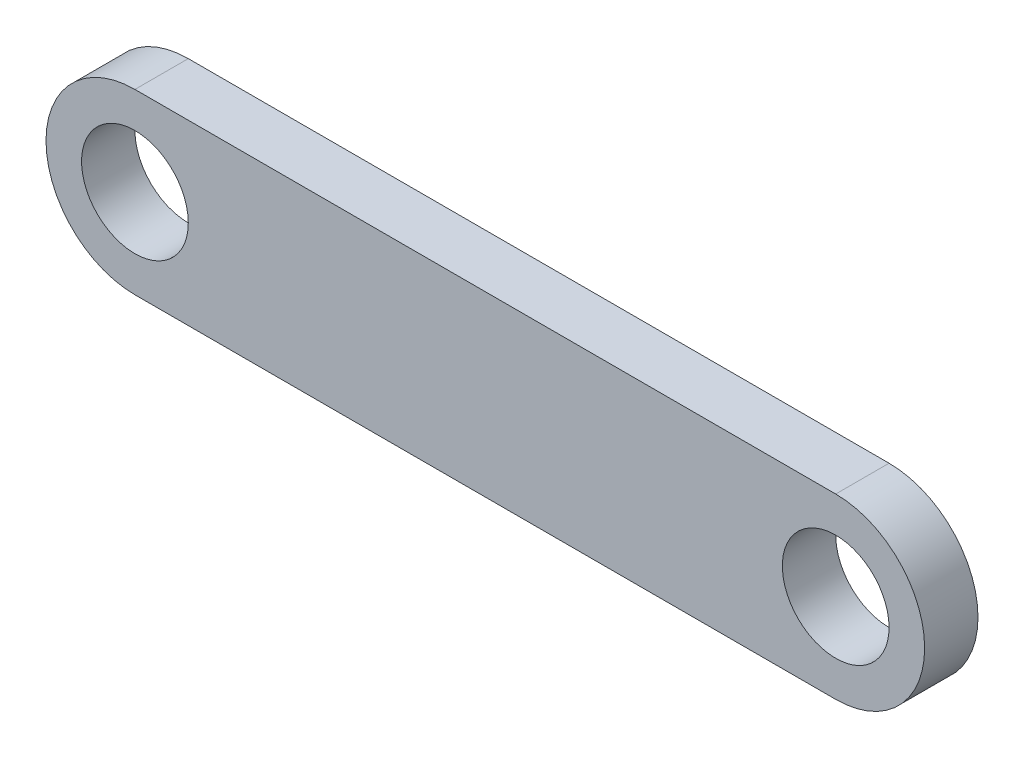
ISO-10303-21;
HEADER;
FILE_DESCRIPTION(('STEP AP214'),'2;1');
FILE_NAME('part.step','',(''),(''),'','','');
FILE_SCHEMA(('AUTOMOTIVE_DESIGN { 1 0 10303 214 1 1 1 1 }'));
ENDSEC;
DATA;
#1=APPLICATION_CONTEXT('core data for automotive mechanical design processes');
#2=APPLICATION_PROTOCOL_DEFINITION('international standard','automotive_design',2000,#1);
#3=PRODUCT_CONTEXT('',#1,'mechanical');
#4=PRODUCT('Part','Part','',(#3));
#5=PRODUCT_RELATED_PRODUCT_CATEGORY('part','',(#4));
#6=PRODUCT_DEFINITION_FORMATION('','',#4);
#7=PRODUCT_DEFINITION_CONTEXT('part definition',#1,'design');
#8=PRODUCT_DEFINITION('design','',#6,#7);
#9=PRODUCT_DEFINITION_SHAPE('','',#8);
#10=(LENGTH_UNIT() NAMED_UNIT(*) SI_UNIT(.MILLI.,.METRE.));
#11=(NAMED_UNIT(*) PLANE_ANGLE_UNIT() SI_UNIT($,.RADIAN.));
#12=(NAMED_UNIT(*) SI_UNIT($,.STERADIAN.) SOLID_ANGLE_UNIT());
#13=UNCERTAINTY_MEASURE_WITH_UNIT(LENGTH_MEASURE(1.E-05),#10,'distance_accuracy_value','');
#14=(GEOMETRIC_REPRESENTATION_CONTEXT(3) GLOBAL_UNCERTAINTY_ASSIGNED_CONTEXT((#13)) GLOBAL_UNIT_ASSIGNED_CONTEXT((#10,
#11,#12)) REPRESENTATION_CONTEXT('',''));
#15=CARTESIAN_POINT('',(0.,0.,0.));
#16=DIRECTION('',(0.,0.,1.));
#17=DIRECTION('',(1.,0.,0.));
#18=AXIS2_PLACEMENT_3D('',#15,#16,#17);
#19=CARTESIAN_POINT('',(-19.7,0.,3.));
#20=DIRECTION('',(0.,0.,1.));
#21=DIRECTION('',(1.,0.,0.));
#22=AXIS2_PLACEMENT_3D('',#19,#20,#21);
#23=PLANE('',#22);
#24=CARTESIAN_POINT('',(-19.7,0.,3.));
#25=DIRECTION('',(0.,0.,1.));
#26=DIRECTION('',(1.,0.,0.));
#27=AXIS2_PLACEMENT_3D('',#24,#25,#26);
#28=CIRCLE('',#27,3.);
#29=CARTESIAN_POINT('',(-16.7,0.,3.));
#30=VERTEX_POINT('',#29);
#31=EDGE_CURVE('E99',#30,#30,#28,.T.);
#32=ORIENTED_EDGE('',*,*,#31,.F.);
#33=EDGE_LOOP('',(#32));
#34=FACE_BOUND('',#33,.T.);
#35=CARTESIAN_POINT('',(-19.7,0.,3.));
#36=DIRECTION('',(0.,0.,1.));
#37=DIRECTION('',(1.,0.,0.));
#38=AXIS2_PLACEMENT_3D('',#35,#36,#37);
#39=CIRCLE('',#38,5.);
#40=CARTESIAN_POINT('',(-19.7,5.,3.));
#41=VERTEX_POINT('',#40);
#42=CARTESIAN_POINT('',(-19.7,-5.,3.));
#43=VERTEX_POINT('',#42);
#44=EDGE_CURVE('E84',#41,#43,#39,.T.);
#45=ORIENTED_EDGE('',*,*,#44,.T.);
#46=DIRECTION('',(1.,0.,0.));
#47=VECTOR('',#46,1.);
#48=CARTESIAN_POINT('',(-19.7,-5.,3.));
#49=LINE('',#48,#47);
#50=CARTESIAN_POINT('',(19.7,-4.99999999999999,3.));
#51=VERTEX_POINT('',#50);
#52=EDGE_CURVE('E79',#43,#51,#49,.T.);
#53=ORIENTED_EDGE('',*,*,#52,.T.);
#54=CARTESIAN_POINT('',(19.7,0.,3.));
#55=DIRECTION('',(0.,0.,1.));
#56=DIRECTION('',(1.,0.,0.));
#57=AXIS2_PLACEMENT_3D('',#54,#55,#56);
#58=CIRCLE('',#57,5.);
#59=CARTESIAN_POINT('',(19.7,5.00000000000001,3.));
#60=VERTEX_POINT('',#59);
#61=EDGE_CURVE('E82',#51,#60,#58,.T.);
#62=ORIENTED_EDGE('',*,*,#61,.T.);
#63=DIRECTION('',(-1.,0.,0.));
#64=VECTOR('',#63,1.);
#65=CARTESIAN_POINT('',(-19.7,5.,3.));
#66=LINE('',#65,#64);
#67=EDGE_CURVE('E49',#60,#41,#66,.T.);
#68=ORIENTED_EDGE('',*,*,#67,.T.);
#69=EDGE_LOOP('',(#45,#53,#62,#68));
#70=FACE_BOUND('',#69,.T.);
#71=CARTESIAN_POINT('',(19.7,0.,3.));
#72=DIRECTION('',(0.,0.,1.));
#73=DIRECTION('',(1.,0.,0.));
#74=AXIS2_PLACEMENT_3D('',#71,#72,#73);
#75=CIRCLE('',#74,3.);
#76=CARTESIAN_POINT('',(22.7,0.,3.));
#77=VERTEX_POINT('',#76);
#78=EDGE_CURVE('E114',#77,#77,#75,.T.);
#79=ORIENTED_EDGE('',*,*,#78,.F.);
#80=EDGE_LOOP('',(#79));
#81=FACE_BOUND('',#80,.T.);
#82=ADVANCED_FACE('F32',(#34,#70,#81),#23,.T.);
#83=CARTESIAN_POINT('',(-19.7,0.,0.));
#84=DIRECTION('',(0.,0.,1.));
#85=DIRECTION('',(1.,0.,0.));
#86=AXIS2_PLACEMENT_3D('',#83,#84,#85);
#87=PLANE('',#86);
#88=CARTESIAN_POINT('',(-19.7,0.,0.));
#89=DIRECTION('',(0.,0.,1.));
#90=DIRECTION('',(1.,0.,0.));
#91=AXIS2_PLACEMENT_3D('',#88,#89,#90);
#92=CIRCLE('',#91,5.);
#93=CARTESIAN_POINT('',(-19.7,5.,0.));
#94=VERTEX_POINT('',#93);
#95=CARTESIAN_POINT('',(-19.7,-5.,0.));
#96=VERTEX_POINT('',#95);
#97=EDGE_CURVE('E96',#94,#96,#92,.T.);
#98=ORIENTED_EDGE('',*,*,#97,.F.);
#99=DIRECTION('',(-1.,0.,0.));
#100=VECTOR('',#99,1.);
#101=CARTESIAN_POINT('',(-19.7,5.,0.));
#102=LINE('',#101,#100);
#103=CARTESIAN_POINT('',(19.7,5.00000000000001,0.));
#104=VERTEX_POINT('',#103);
#105=EDGE_CURVE('E72',#104,#94,#102,.T.);
#106=ORIENTED_EDGE('',*,*,#105,.F.);
#107=CARTESIAN_POINT('',(19.7,0.,0.));
#108=DIRECTION('',(0.,0.,1.));
#109=DIRECTION('',(1.,0.,0.));
#110=AXIS2_PLACEMENT_3D('',#107,#108,#109);
#111=CIRCLE('',#110,5.);
#112=CARTESIAN_POINT('',(19.7,-4.99999999999999,0.));
#113=VERTEX_POINT('',#112);
#114=EDGE_CURVE('E66',#113,#104,#111,.T.);
#115=ORIENTED_EDGE('',*,*,#114,.F.);
#116=DIRECTION('',(1.,0.,0.));
#117=VECTOR('',#116,1.);
#118=CARTESIAN_POINT('',(-19.7,-5.,0.));
#119=LINE('',#118,#117);
#120=EDGE_CURVE('E88',#96,#113,#119,.T.);
#121=ORIENTED_EDGE('',*,*,#120,.F.);
#122=EDGE_LOOP('',(#98,#106,#115,#121));
#123=FACE_BOUND('',#122,.T.);
#124=CARTESIAN_POINT('',(-19.7,0.,0.));
#125=DIRECTION('',(0.,0.,1.));
#126=DIRECTION('',(1.,0.,0.));
#127=AXIS2_PLACEMENT_3D('',#124,#125,#126);
#128=CIRCLE('',#127,3.);
#129=CARTESIAN_POINT('',(-16.7,0.,0.));
#130=VERTEX_POINT('',#129);
#131=EDGE_CURVE('E111',#130,#130,#128,.T.);
#132=ORIENTED_EDGE('',*,*,#131,.T.);
#133=EDGE_LOOP('',(#132));
#134=FACE_BOUND('',#133,.T.);
#135=CARTESIAN_POINT('',(19.7,0.,0.));
#136=DIRECTION('',(0.,0.,1.));
#137=DIRECTION('',(1.,0.,0.));
#138=AXIS2_PLACEMENT_3D('',#135,#136,#137);
#139=CIRCLE('',#138,3.);
#140=CARTESIAN_POINT('',(22.7,0.,0.));
#141=VERTEX_POINT('',#140);
#142=EDGE_CURVE('E117',#141,#141,#139,.T.);
#143=ORIENTED_EDGE('',*,*,#142,.T.);
#144=EDGE_LOOP('',(#143));
#145=FACE_BOUND('',#144,.T.);
#146=ADVANCED_FACE('F107',(#123,#134,#145),#87,.F.);
#147=CARTESIAN_POINT('',(-19.7,0.,3.));
#148=DIRECTION('',(0.,0.,-1.));
#149=DIRECTION('',(-1.,0.,0.));
#150=AXIS2_PLACEMENT_3D('',#147,#148,#149);
#151=CYLINDRICAL_SURFACE('',#150,5.);
#152=ORIENTED_EDGE('',*,*,#97,.T.);
#153=DIRECTION('',(0.,0.,-1.));
#154=VECTOR('',#153,1.);
#155=CARTESIAN_POINT('',(-19.7,-5.,3.));
#156=LINE('',#155,#154);
#157=EDGE_CURVE('E11',#43,#96,#156,.T.);
#158=ORIENTED_EDGE('',*,*,#157,.F.);
#159=ORIENTED_EDGE('',*,*,#44,.F.);
#160=DIRECTION('',(0.,0.,-1.));
#161=VECTOR('',#160,1.);
#162=CARTESIAN_POINT('',(-19.7,5.,3.));
#163=LINE('',#162,#161);
#164=EDGE_CURVE('E92',#41,#94,#163,.T.);
#165=ORIENTED_EDGE('',*,*,#164,.T.);
#166=EDGE_LOOP('',(#152,#158,#159,#165));
#167=FACE_BOUND('',#166,.T.);
#168=ADVANCED_FACE('F34',(#167),#151,.T.);
#169=CARTESIAN_POINT('',(-19.7,-5.,3.));
#170=DIRECTION('',(0.,1.,0.));
#171=DIRECTION('',(-1.,0.,0.));
#172=AXIS2_PLACEMENT_3D('',#169,#170,#171);
#173=PLANE('',#172);
#174=ORIENTED_EDGE('',*,*,#120,.T.);
#175=DIRECTION('',(0.,0.,-1.));
#176=VECTOR('',#175,1.);
#177=CARTESIAN_POINT('',(19.7,-4.99999999999999,3.));
#178=LINE('',#177,#176);
#179=EDGE_CURVE('E41',#51,#113,#178,.T.);
#180=ORIENTED_EDGE('',*,*,#179,.F.);
#181=ORIENTED_EDGE('',*,*,#52,.F.);
#182=ORIENTED_EDGE('',*,*,#157,.T.);
#183=EDGE_LOOP('',(#174,#180,#181,#182));
#184=FACE_BOUND('',#183,.T.);
#185=ADVANCED_FACE('F87',(#184),#173,.F.);
#186=CARTESIAN_POINT('',(19.7,0.,3.));
#187=DIRECTION('',(0.,0.,-1.));
#188=DIRECTION('',(-1.,0.,0.));
#189=AXIS2_PLACEMENT_3D('',#186,#187,#188);
#190=CYLINDRICAL_SURFACE('',#189,5.);
#191=ORIENTED_EDGE('',*,*,#114,.T.);
#192=DIRECTION('',(0.,0.,-1.));
#193=VECTOR('',#192,1.);
#194=CARTESIAN_POINT('',(19.7,5.00000000000001,3.));
#195=LINE('',#194,#193);
#196=EDGE_CURVE('E89',#60,#104,#195,.T.);
#197=ORIENTED_EDGE('',*,*,#196,.F.);
#198=ORIENTED_EDGE('',*,*,#61,.F.);
#199=ORIENTED_EDGE('',*,*,#179,.T.);
#200=EDGE_LOOP('',(#191,#197,#198,#199));
#201=FACE_BOUND('',#200,.T.);
#202=ADVANCED_FACE('F90',(#201),#190,.T.);
#203=CARTESIAN_POINT('',(-19.7,5.,3.));
#204=DIRECTION('',(0.,-1.,0.));
#205=DIRECTION('',(1.,0.,0.));
#206=AXIS2_PLACEMENT_3D('',#203,#204,#205);
#207=PLANE('',#206);
#208=ORIENTED_EDGE('',*,*,#105,.T.);
#209=ORIENTED_EDGE('',*,*,#164,.F.);
#210=ORIENTED_EDGE('',*,*,#67,.F.);
#211=ORIENTED_EDGE('',*,*,#196,.T.);
#212=EDGE_LOOP('',(#208,#209,#210,#211));
#213=FACE_BOUND('',#212,.T.);
#214=ADVANCED_FACE('F104',(#213),#207,.F.);
#215=CARTESIAN_POINT('',(-19.7,0.,3.));
#216=DIRECTION('',(0.,0.,-1.));
#217=DIRECTION('',(-1.,0.,0.));
#218=AXIS2_PLACEMENT_3D('',#215,#216,#217);
#219=CYLINDRICAL_SURFACE('',#218,3.);
#220=ORIENTED_EDGE('',*,*,#31,.T.);
#221=EDGE_LOOP('',(#220));
#222=FACE_BOUND('',#221,.T.);
#223=ORIENTED_EDGE('',*,*,#131,.F.);
#224=EDGE_LOOP('',(#223));
#225=FACE_BOUND('',#224,.T.);
#226=ADVANCED_FACE('F134',(#222,#225),#219,.F.);
#227=CARTESIAN_POINT('',(19.7,0.,3.));
#228=DIRECTION('',(0.,0.,-1.));
#229=DIRECTION('',(-1.,0.,0.));
#230=AXIS2_PLACEMENT_3D('',#227,#228,#229);
#231=CYLINDRICAL_SURFACE('',#230,3.);
#232=ORIENTED_EDGE('',*,*,#78,.T.);
#233=EDGE_LOOP('',(#232));
#234=FACE_BOUND('',#233,.T.);
#235=ORIENTED_EDGE('',*,*,#142,.F.);
#236=EDGE_LOOP('',(#235));
#237=FACE_BOUND('',#236,.T.);
#238=ADVANCED_FACE('F123',(#234,#237),#231,.F.);
#239=CLOSED_SHELL('',(#82,#146,#168,#185,#202,#214,#226,#238));
#240=MANIFOLD_SOLID_BREP('B2',#239);
#241=ADVANCED_BREP_SHAPE_REPRESENTATION('',(#18,#240),#14);
#242=SHAPE_DEFINITION_REPRESENTATION(#9,#241);
ENDSEC;
END-ISO-10303-21;
